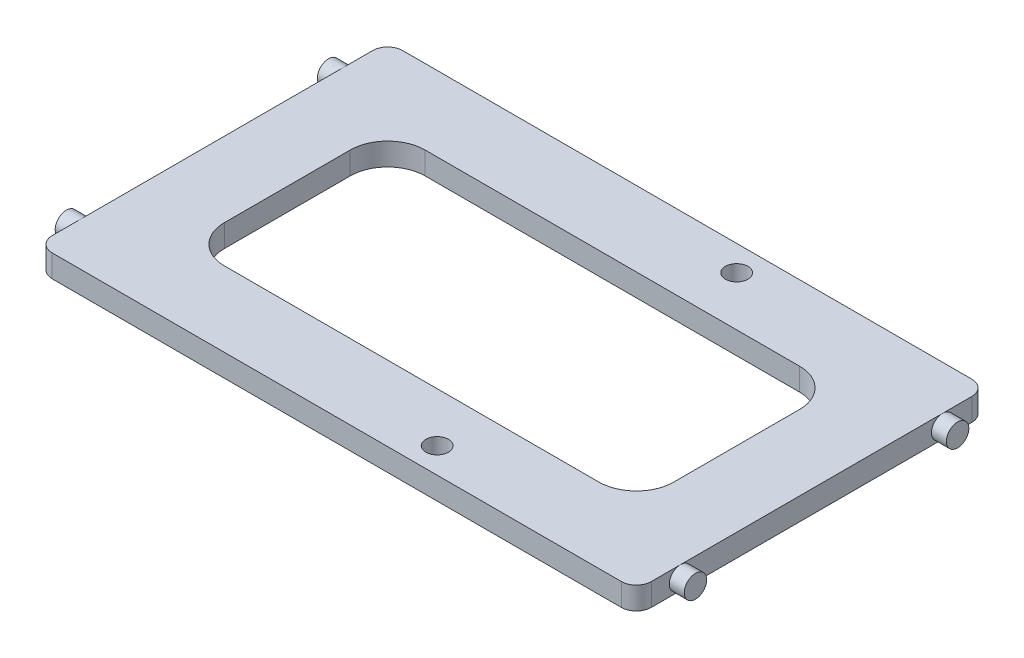
ISO-10303-21;
HEADER;
FILE_DESCRIPTION(('STEP AP214'),'2;1');
FILE_NAME('part.step','',(''),(''),'','','');
FILE_SCHEMA(('AUTOMOTIVE_DESIGN { 1 0 10303 214 1 1 1 1 }'));
ENDSEC;
DATA;
#1=APPLICATION_CONTEXT('core data for automotive mechanical design processes');
#2=APPLICATION_PROTOCOL_DEFINITION('international standard','automotive_design',2000,#1);
#3=PRODUCT_CONTEXT('',#1,'mechanical');
#4=PRODUCT('Part','Part','',(#3));
#5=PRODUCT_RELATED_PRODUCT_CATEGORY('part','',(#4));
#6=PRODUCT_DEFINITION_FORMATION('','',#4);
#7=PRODUCT_DEFINITION_CONTEXT('part definition',#1,'design');
#8=PRODUCT_DEFINITION('design','',#6,#7);
#9=PRODUCT_DEFINITION_SHAPE('','',#8);
#10=(LENGTH_UNIT() NAMED_UNIT(*) SI_UNIT(.MILLI.,.METRE.));
#11=(NAMED_UNIT(*) PLANE_ANGLE_UNIT() SI_UNIT($,.RADIAN.));
#12=(NAMED_UNIT(*) SI_UNIT($,.STERADIAN.) SOLID_ANGLE_UNIT());
#13=UNCERTAINTY_MEASURE_WITH_UNIT(LENGTH_MEASURE(1.E-05),#10,'distance_accuracy_value','');
#14=(GEOMETRIC_REPRESENTATION_CONTEXT(3) GLOBAL_UNCERTAINTY_ASSIGNED_CONTEXT((#13)) GLOBAL_UNIT_ASSIGNED_CONTEXT((#10,
#11,#12)) REPRESENTATION_CONTEXT('',''));
#15=CARTESIAN_POINT('',(0.,0.,0.));
#16=DIRECTION('',(0.,0.,1.));
#17=DIRECTION('',(1.,0.,0.));
#18=AXIS2_PLACEMENT_3D('',#15,#16,#17);
#19=CARTESIAN_POINT('',(101.6,3.81,0.));
#20=DIRECTION('',(-1.,0.,0.));
#21=DIRECTION('',(0.,0.,1.));
#22=AXIS2_PLACEMENT_3D('',#19,#20,#21);
#23=PLANE('',#22);
#24=DIRECTION('',(0.,0.,-1.));
#25=VECTOR('',#24,1.);
#26=CARTESIAN_POINT('',(101.6,3.81,0.));
#27=LINE('',#26,#25);
#28=CARTESIAN_POINT('',(101.6,3.81,-51.943));
#29=VERTEX_POINT('',#28);
#30=CARTESIAN_POINT('',(101.6,3.81,-56.896));
#31=VERTEX_POINT('',#30);
#32=EDGE_CURVE('E279',#29,#31,#27,.T.);
#33=ORIENTED_EDGE('',*,*,#32,.F.);
#34=CARTESIAN_POINT('',(101.6,1.905,-51.943));
#35=DIRECTION('',(-1.,0.,0.));
#36=DIRECTION('',(0.,0.,-1.));
#37=AXIS2_PLACEMENT_3D('',#34,#35,#36);
#38=CIRCLE('',#37,1.905);
#39=CARTESIAN_POINT('',(101.6,0.,-51.943));
#40=VERTEX_POINT('',#39);
#41=EDGE_CURVE('E231',#29,#40,#38,.T.);
#42=ORIENTED_EDGE('',*,*,#41,.T.);
#43=DIRECTION('',(0.,0.,-1.));
#44=VECTOR('',#43,1.);
#45=CARTESIAN_POINT('',(101.6,0.,0.));
#46=LINE('',#45,#44);
#47=CARTESIAN_POINT('',(101.6,0.,-56.896));
#48=VERTEX_POINT('',#47);
#49=EDGE_CURVE('E294',#40,#48,#46,.T.);
#50=ORIENTED_EDGE('',*,*,#49,.T.);
#51=DIRECTION('',(0.,-1.,0.));
#52=VECTOR('',#51,1.);
#53=CARTESIAN_POINT('',(101.6,3.81,-56.896));
#54=LINE('',#53,#52);
#55=EDGE_CURVE('E11',#48,#31,#54,.F.);
#56=ORIENTED_EDGE('',*,*,#55,.T.);
#57=EDGE_LOOP('',(#33,#42,#50,#56));
#58=FACE_BOUND('',#57,.T.);
#59=ADVANCED_FACE('F33',(#58),#23,.F.);
#60=CARTESIAN_POINT('',(101.6,0.,-7.493));
#61=VERTEX_POINT('',#60);
#62=EDGE_CURVE('E299',#61,#40,#46,.T.);
#63=ORIENTED_EDGE('',*,*,#62,.T.);
#64=EDGE_CURVE('E247',#40,#29,#38,.T.);
#65=ORIENTED_EDGE('',*,*,#64,.T.);
#66=CARTESIAN_POINT('',(101.6,3.81,-7.493));
#67=VERTEX_POINT('',#66);
#68=EDGE_CURVE('E284',#67,#29,#27,.T.);
#69=ORIENTED_EDGE('',*,*,#68,.F.);
#70=CARTESIAN_POINT('',(101.6,1.905,-7.493));
#71=DIRECTION('',(-1.,0.,0.));
#72=DIRECTION('',(0.,0.,1.));
#73=AXIS2_PLACEMENT_3D('',#70,#71,#72);
#74=CIRCLE('',#73,1.905);
#75=EDGE_CURVE('E254',#67,#61,#74,.T.);
#76=ORIENTED_EDGE('',*,*,#75,.T.);
#77=EDGE_LOOP('',(#63,#65,#69,#76));
#78=FACE_BOUND('',#77,.T.);
#79=ADVANCED_FACE('F411',(#78),#23,.F.);
#80=CARTESIAN_POINT('',(0.,3.81,0.));
#81=DIRECTION('',(1.,0.,0.));
#82=DIRECTION('',(0.,0.,-1.));
#83=AXIS2_PLACEMENT_3D('',#80,#81,#82);
#84=PLANE('',#83);
#85=CARTESIAN_POINT('',(0.,1.905,-51.943));
#86=DIRECTION('',(-1.,0.,0.));
#87=DIRECTION('',(0.,0.,-1.));
#88=AXIS2_PLACEMENT_3D('',#85,#86,#87);
#89=CIRCLE('',#88,1.905);
#90=CARTESIAN_POINT('',(0.,0.,-51.943));
#91=VERTEX_POINT('',#90);
#92=CARTESIAN_POINT('',(0.,3.81,-51.943));
#93=VERTEX_POINT('',#92);
#94=EDGE_CURVE('E261',#91,#93,#89,.T.);
#95=ORIENTED_EDGE('',*,*,#94,.F.);
#96=DIRECTION('',(0.,0.,1.));
#97=VECTOR('',#96,1.);
#98=CARTESIAN_POINT('',(0.,0.,0.));
#99=LINE('',#98,#97);
#100=CARTESIAN_POINT('',(0.,0.,-7.493));
#101=VERTEX_POINT('',#100);
#102=EDGE_CURVE('E291',#91,#101,#99,.T.);
#103=ORIENTED_EDGE('',*,*,#102,.T.);
#104=CARTESIAN_POINT('',(0.,1.905,-7.493));
#105=DIRECTION('',(-1.,0.,0.));
#106=DIRECTION('',(0.,0.,1.));
#107=AXIS2_PLACEMENT_3D('',#104,#105,#106);
#108=CIRCLE('',#107,1.905);
#109=CARTESIAN_POINT('',(0.,3.81,-7.493));
#110=VERTEX_POINT('',#109);
#111=EDGE_CURVE('E268',#110,#101,#108,.T.);
#112=ORIENTED_EDGE('',*,*,#111,.F.);
#113=DIRECTION('',(0.,0.,1.));
#114=VECTOR('',#113,1.);
#115=CARTESIAN_POINT('',(0.,3.81,0.));
#116=LINE('',#115,#114);
#117=EDGE_CURVE('E275',#93,#110,#116,.T.);
#118=ORIENTED_EDGE('',*,*,#117,.F.);
#119=EDGE_LOOP('',(#95,#103,#112,#118));
#120=FACE_BOUND('',#119,.T.);
#121=ADVANCED_FACE('F379',(#120),#84,.F.);
#122=EDGE_CURVE('E260',#101,#110,#108,.T.);
#123=ORIENTED_EDGE('',*,*,#122,.F.);
#124=CARTESIAN_POINT('',(0.,0.,-2.54));
#125=VERTEX_POINT('',#124);
#126=EDGE_CURVE('E267',#101,#125,#99,.T.);
#127=ORIENTED_EDGE('',*,*,#126,.T.);
#128=DIRECTION('',(0.,-1.,0.));
#129=VECTOR('',#128,1.);
#130=CARTESIAN_POINT('',(0.,3.81,-2.54));
#131=LINE('',#130,#129);
#132=CARTESIAN_POINT('',(0.,3.81,-2.54));
#133=VERTEX_POINT('',#132);
#134=EDGE_CURVE('E319',#125,#133,#131,.F.);
#135=ORIENTED_EDGE('',*,*,#134,.T.);
#136=EDGE_CURVE('E276',#110,#133,#116,.T.);
#137=ORIENTED_EDGE('',*,*,#136,.F.);
#138=EDGE_LOOP('',(#123,#127,#135,#137));
#139=FACE_BOUND('',#138,.T.);
#140=ADVANCED_FACE('F387',(#139),#84,.F.);
#141=EDGE_CURVE('E253',#93,#91,#89,.T.);
#142=ORIENTED_EDGE('',*,*,#141,.F.);
#143=CARTESIAN_POINT('',(0.,3.81,-56.896));
#144=VERTEX_POINT('',#143);
#145=EDGE_CURVE('E271',#144,#93,#116,.T.);
#146=ORIENTED_EDGE('',*,*,#145,.F.);
#147=DIRECTION('',(0.,-1.,0.));
#148=VECTOR('',#147,1.);
#149=CARTESIAN_POINT('',(0.,3.81,-56.896));
#150=LINE('',#149,#148);
#151=CARTESIAN_POINT('',(0.,0.,-56.896));
#152=VERTEX_POINT('',#151);
#153=EDGE_CURVE('E316',#144,#152,#150,.T.);
#154=ORIENTED_EDGE('',*,*,#153,.T.);
#155=EDGE_CURVE('E288',#152,#91,#99,.T.);
#156=ORIENTED_EDGE('',*,*,#155,.T.);
#157=EDGE_LOOP('',(#142,#146,#154,#156));
#158=FACE_BOUND('',#157,.T.);
#159=ADVANCED_FACE('F370',(#158),#84,.F.);
#160=CARTESIAN_POINT('',(0.,3.81,0.));
#161=DIRECTION('',(0.,0.,-1.));
#162=DIRECTION('',(-1.,0.,0.));
#163=AXIS2_PLACEMENT_3D('',#160,#161,#162);
#164=PLANE('',#163);
#165=DIRECTION('',(1.,0.,0.));
#166=VECTOR('',#165,1.);
#167=CARTESIAN_POINT('',(0.,3.81,0.));
#168=LINE('',#167,#166);
#169=CARTESIAN_POINT('',(2.54,3.81,0.));
#170=VERTEX_POINT('',#169);
#171=CARTESIAN_POINT('',(99.06,3.81,0.));
#172=VERTEX_POINT('',#171);
#173=EDGE_CURVE('E274',#170,#172,#168,.T.);
#174=ORIENTED_EDGE('',*,*,#173,.F.);
#175=DIRECTION('',(0.,-1.,0.));
#176=VECTOR('',#175,1.);
#177=CARTESIAN_POINT('',(2.54,3.81,0.));
#178=LINE('',#177,#176);
#179=CARTESIAN_POINT('',(2.54,0.,0.));
#180=VERTEX_POINT('',#179);
#181=EDGE_CURVE('E303',#170,#180,#178,.T.);
#182=ORIENTED_EDGE('',*,*,#181,.T.);
#183=DIRECTION('',(1.,0.,0.));
#184=VECTOR('',#183,1.);
#185=CARTESIAN_POINT('',(0.,0.,0.));
#186=LINE('',#185,#184);
#187=CARTESIAN_POINT('',(99.06,0.,0.));
#188=VERTEX_POINT('',#187);
#189=EDGE_CURVE('E290',#180,#188,#186,.T.);
#190=ORIENTED_EDGE('',*,*,#189,.T.);
#191=DIRECTION('',(0.,-1.,0.));
#192=VECTOR('',#191,1.);
#193=CARTESIAN_POINT('',(99.06,3.81,0.));
#194=LINE('',#193,#192);
#195=EDGE_CURVE('E287',#188,#172,#194,.F.);
#196=ORIENTED_EDGE('',*,*,#195,.T.);
#197=EDGE_LOOP('',(#174,#182,#190,#196));
#198=FACE_BOUND('',#197,.T.);
#199=ADVANCED_FACE('F393',(#198),#164,.F.);
#200=CARTESIAN_POINT('',(101.6,0.,-2.54));
#201=VERTEX_POINT('',#200);
#202=EDGE_CURVE('E295',#201,#61,#46,.T.);
#203=ORIENTED_EDGE('',*,*,#202,.T.);
#204=EDGE_CURVE('E246',#61,#67,#74,.T.);
#205=ORIENTED_EDGE('',*,*,#204,.T.);
#206=CARTESIAN_POINT('',(101.6,3.81,-2.54));
#207=VERTEX_POINT('',#206);
#208=EDGE_CURVE('E280',#207,#67,#27,.T.);
#209=ORIENTED_EDGE('',*,*,#208,.F.);
#210=DIRECTION('',(0.,-1.,0.));
#211=VECTOR('',#210,1.);
#212=CARTESIAN_POINT('',(101.6,3.81,-2.54));
#213=LINE('',#212,#211);
#214=EDGE_CURVE('E41',#207,#201,#213,.T.);
#215=ORIENTED_EDGE('',*,*,#214,.T.);
#216=EDGE_LOOP('',(#203,#205,#209,#215));
#217=FACE_BOUND('',#216,.T.);
#218=ADVANCED_FACE('F339',(#217),#23,.F.);
#219=CARTESIAN_POINT('',(0.,3.81,-59.436));
#220=DIRECTION('',(0.,0.,1.));
#221=DIRECTION('',(1.,0.,0.));
#222=AXIS2_PLACEMENT_3D('',#219,#220,#221);
#223=PLANE('',#222);
#224=DIRECTION('',(-1.,0.,0.));
#225=VECTOR('',#224,1.);
#226=CARTESIAN_POINT('',(0.,0.,-59.436));
#227=LINE('',#226,#225);
#228=CARTESIAN_POINT('',(99.06,0.,-59.436));
#229=VERTEX_POINT('',#228);
#230=CARTESIAN_POINT('',(2.54,0.,-59.436));
#231=VERTEX_POINT('',#230);
#232=EDGE_CURVE('E298',#229,#231,#227,.T.);
#233=ORIENTED_EDGE('',*,*,#232,.T.);
#234=DIRECTION('',(0.,-1.,0.));
#235=VECTOR('',#234,1.);
#236=CARTESIAN_POINT('',(2.54,3.81,-59.436));
#237=LINE('',#236,#235);
#238=CARTESIAN_POINT('',(2.54,3.81,-59.436));
#239=VERTEX_POINT('',#238);
#240=EDGE_CURVE('E333',#231,#239,#237,.F.);
#241=ORIENTED_EDGE('',*,*,#240,.T.);
#242=DIRECTION('',(-1.,0.,0.));
#243=VECTOR('',#242,1.);
#244=CARTESIAN_POINT('',(0.,3.81,-59.436));
#245=LINE('',#244,#243);
#246=CARTESIAN_POINT('',(99.06,3.81,-59.436));
#247=VERTEX_POINT('',#246);
#248=EDGE_CURVE('E283',#247,#239,#245,.T.);
#249=ORIENTED_EDGE('',*,*,#248,.F.);
#250=DIRECTION('',(0.,-1.,0.));
#251=VECTOR('',#250,1.);
#252=CARTESIAN_POINT('',(99.06,3.81,-59.436));
#253=LINE('',#252,#251);
#254=EDGE_CURVE('E330',#247,#229,#253,.T.);
#255=ORIENTED_EDGE('',*,*,#254,.T.);
#256=EDGE_LOOP('',(#233,#241,#249,#255));
#257=FACE_BOUND('',#256,.T.);
#258=ADVANCED_FACE('F363',(#257),#223,.F.);
#259=CARTESIAN_POINT('',(0.,3.81,0.));
#260=DIRECTION('',(0.,-1.,0.));
#261=DIRECTION('',(0.,0.,-1.));
#262=AXIS2_PLACEMENT_3D('',#259,#260,#261);
#263=PLANE('',#262);
#264=CARTESIAN_POINT('',(63.5,3.81,-4.318));
#265=DIRECTION('',(0.,1.,0.));
#266=DIRECTION('',(0.,0.,1.));
#267=AXIS2_PLACEMENT_3D('',#264,#265,#266);
#268=CIRCLE('',#267,1.90500000000001);
#269=CARTESIAN_POINT('',(63.5,3.81,-2.41299999999999));
#270=VERTEX_POINT('',#269);
#271=EDGE_CURVE('E662',#270,#270,#268,.T.);
#272=ORIENTED_EDGE('',*,*,#271,.F.);
#273=EDGE_LOOP('',(#272));
#274=FACE_BOUND('',#273,.T.);
#275=CARTESIAN_POINT('',(63.5,3.81,-55.118));
#276=DIRECTION('',(0.,1.,0.));
#277=DIRECTION('',(0.,0.,1.));
#278=AXIS2_PLACEMENT_3D('',#275,#276,#277);
#279=CIRCLE('',#278,1.90500000000001);
#280=CARTESIAN_POINT('',(63.5,3.81,-53.213));
#281=VERTEX_POINT('',#280);
#282=EDGE_CURVE('E195',#281,#281,#279,.T.);
#283=ORIENTED_EDGE('',*,*,#282,.F.);
#284=EDGE_LOOP('',(#283));
#285=FACE_BOUND('',#284,.T.);
#286=DIRECTION('',(0.,0.,1.));
#287=VECTOR('',#286,1.);
#288=CARTESIAN_POINT('',(88.9,3.81,-19.05));
#289=LINE('',#288,#287);
#290=CARTESIAN_POINT('',(88.9,3.81,-40.386));
#291=VERTEX_POINT('',#290);
#292=CARTESIAN_POINT('',(88.9,3.81,-19.05));
#293=VERTEX_POINT('',#292);
#294=EDGE_CURVE('E178',#291,#293,#289,.T.);
#295=ORIENTED_EDGE('',*,*,#294,.T.);
#296=CARTESIAN_POINT('',(82.55,3.81,-19.05));
#297=DIRECTION('',(0.,-1.,0.));
#298=DIRECTION('',(0.,0.,1.));
#299=AXIS2_PLACEMENT_3D('',#296,#297,#298);
#300=CIRCLE('',#299,6.35);
#301=CARTESIAN_POINT('',(82.5499999999999,3.81,-12.7));
#302=VERTEX_POINT('',#301);
#303=EDGE_CURVE('E172',#293,#302,#300,.T.);
#304=ORIENTED_EDGE('',*,*,#303,.T.);
#305=DIRECTION('',(-1.,0.,0.));
#306=VECTOR('',#305,1.);
#307=CARTESIAN_POINT('',(19.05,3.81,-12.7));
#308=LINE('',#307,#306);
#309=CARTESIAN_POINT('',(19.05,3.81,-12.7));
#310=VERTEX_POINT('',#309);
#311=EDGE_CURVE('E181',#302,#310,#308,.T.);
#312=ORIENTED_EDGE('',*,*,#311,.T.);
#313=CARTESIAN_POINT('',(19.05,3.81,-19.05));
#314=DIRECTION('',(0.,-1.,0.));
#315=DIRECTION('',(0.,0.,-1.));
#316=AXIS2_PLACEMENT_3D('',#313,#314,#315);
#317=CIRCLE('',#316,6.35);
#318=CARTESIAN_POINT('',(12.7,3.81,-19.05));
#319=VERTEX_POINT('',#318);
#320=EDGE_CURVE('E48',#310,#319,#317,.T.);
#321=ORIENTED_EDGE('',*,*,#320,.T.);
#322=DIRECTION('',(0.,0.,-1.));
#323=VECTOR('',#322,1.);
#324=CARTESIAN_POINT('',(12.7,3.81,-19.05));
#325=LINE('',#324,#323);
#326=CARTESIAN_POINT('',(12.7,3.81,-40.386));
#327=VERTEX_POINT('',#326);
#328=EDGE_CURVE('E199',#319,#327,#325,.T.);
#329=ORIENTED_EDGE('',*,*,#328,.T.);
#330=CARTESIAN_POINT('',(19.05,3.81,-40.386));
#331=DIRECTION('',(0.,-1.,0.));
#332=DIRECTION('',(0.,0.,-1.));
#333=AXIS2_PLACEMENT_3D('',#330,#331,#332);
#334=CIRCLE('',#333,6.35);
#335=CARTESIAN_POINT('',(19.05,3.81,-46.736));
#336=VERTEX_POINT('',#335);
#337=EDGE_CURVE('E202',#327,#336,#334,.T.);
#338=ORIENTED_EDGE('',*,*,#337,.T.);
#339=DIRECTION('',(1.,0.,0.));
#340=VECTOR('',#339,1.);
#341=CARTESIAN_POINT('',(19.05,3.81,-46.736));
#342=LINE('',#341,#340);
#343=CARTESIAN_POINT('',(82.5499999999999,3.81,-46.736));
#344=VERTEX_POINT('',#343);
#345=EDGE_CURVE('E205',#336,#344,#342,.T.);
#346=ORIENTED_EDGE('',*,*,#345,.T.);
#347=CARTESIAN_POINT('',(82.55,3.81,-40.386));
#348=DIRECTION('',(0.,-1.,0.));
#349=DIRECTION('',(0.,0.,-1.));
#350=AXIS2_PLACEMENT_3D('',#347,#348,#349);
#351=CIRCLE('',#350,6.34999999999999);
#352=EDGE_CURVE('E208',#344,#291,#351,.T.);
#353=ORIENTED_EDGE('',*,*,#352,.T.);
#354=EDGE_LOOP('',(#295,#304,#312,#321,#329,#338,#346,#353));
#355=FACE_BOUND('',#354,.T.);
#356=ORIENTED_EDGE('',*,*,#145,.T.);
#357=ORIENTED_EDGE('',*,*,#117,.T.);
#358=ORIENTED_EDGE('',*,*,#136,.T.);
#359=CARTESIAN_POINT('',(2.54,3.81,-2.54));
#360=DIRECTION('',(0.,-1.,0.));
#361=DIRECTION('',(0.,0.,-1.));
#362=AXIS2_PLACEMENT_3D('',#359,#360,#361);
#363=CIRCLE('',#362,2.54);
#364=EDGE_CURVE('E328',#133,#170,#363,.F.);
#365=ORIENTED_EDGE('',*,*,#364,.T.);
#366=ORIENTED_EDGE('',*,*,#173,.T.);
#367=CARTESIAN_POINT('',(99.06,3.81,-2.54));
#368=DIRECTION('',(0.,-1.,0.));
#369=DIRECTION('',(0.,0.,-1.));
#370=AXIS2_PLACEMENT_3D('',#367,#368,#369);
#371=CIRCLE('',#370,2.54);
#372=EDGE_CURVE('E322',#172,#207,#371,.F.);
#373=ORIENTED_EDGE('',*,*,#372,.T.);
#374=ORIENTED_EDGE('',*,*,#208,.T.);
#375=ORIENTED_EDGE('',*,*,#68,.T.);
#376=ORIENTED_EDGE('',*,*,#32,.T.);
#377=CARTESIAN_POINT('',(99.06,3.81,-56.896));
#378=DIRECTION('',(0.,-1.,0.));
#379=DIRECTION('',(0.,0.,-1.));
#380=AXIS2_PLACEMENT_3D('',#377,#378,#379);
#381=CIRCLE('',#380,2.54);
#382=EDGE_CURVE('E324',#31,#247,#381,.F.);
#383=ORIENTED_EDGE('',*,*,#382,.T.);
#384=ORIENTED_EDGE('',*,*,#248,.T.);
#385=CARTESIAN_POINT('',(2.54,3.81,-56.896));
#386=DIRECTION('',(0.,-1.,0.));
#387=DIRECTION('',(0.,0.,-1.));
#388=AXIS2_PLACEMENT_3D('',#385,#386,#387);
#389=CIRCLE('',#388,2.54);
#390=EDGE_CURVE('E326',#239,#144,#389,.F.);
#391=ORIENTED_EDGE('',*,*,#390,.T.);
#392=EDGE_LOOP('',(#356,#357,#358,#365,#366,#373,#374,#375,#376,#383,#384,#391));
#393=FACE_BOUND('',#392,.T.);
#394=ADVANCED_FACE('F185',(#274,#285,#355,#393),#263,.F.);
#395=CARTESIAN_POINT('',(0.,0.,0.));
#396=DIRECTION('',(0.,-1.,0.));
#397=DIRECTION('',(0.,0.,-1.));
#398=AXIS2_PLACEMENT_3D('',#395,#396,#397);
#399=PLANE('',#398);
#400=CARTESIAN_POINT('',(63.5,0.,-4.318));
#401=DIRECTION('',(0.,1.,0.));
#402=DIRECTION('',(0.,0.,1.));
#403=AXIS2_PLACEMENT_3D('',#400,#401,#402);
#404=CIRCLE('',#403,1.90500000000001);
#405=CARTESIAN_POINT('',(63.5,0.,-2.41299999999999));
#406=VERTEX_POINT('',#405);
#407=EDGE_CURVE('E213',#406,#406,#404,.T.);
#408=ORIENTED_EDGE('',*,*,#407,.T.);
#409=EDGE_LOOP('',(#408));
#410=FACE_BOUND('',#409,.T.);
#411=CARTESIAN_POINT('',(63.5,0.,-55.118));
#412=DIRECTION('',(0.,1.,0.));
#413=DIRECTION('',(0.,0.,1.));
#414=AXIS2_PLACEMENT_3D('',#411,#412,#413);
#415=CIRCLE('',#414,1.90500000000001);
#416=CARTESIAN_POINT('',(63.5,0.,-53.213));
#417=VERTEX_POINT('',#416);
#418=EDGE_CURVE('E663',#417,#417,#415,.T.);
#419=ORIENTED_EDGE('',*,*,#418,.T.);
#420=EDGE_LOOP('',(#419));
#421=FACE_BOUND('',#420,.T.);
#422=CARTESIAN_POINT('',(82.55,0.,-19.05));
#423=DIRECTION('',(0.,-1.,0.));
#424=DIRECTION('',(0.,0.,1.));
#425=AXIS2_PLACEMENT_3D('',#422,#423,#424);
#426=CIRCLE('',#425,6.35);
#427=CARTESIAN_POINT('',(88.9,0.,-19.05));
#428=VERTEX_POINT('',#427);
#429=CARTESIAN_POINT('',(82.5499999999999,0.,-12.7));
#430=VERTEX_POINT('',#429);
#431=EDGE_CURVE('E56',#428,#430,#426,.T.);
#432=ORIENTED_EDGE('',*,*,#431,.F.);
#433=DIRECTION('',(0.,0.,1.));
#434=VECTOR('',#433,1.);
#435=CARTESIAN_POINT('',(88.9,0.,-19.05));
#436=LINE('',#435,#434);
#437=CARTESIAN_POINT('',(88.9,0.,-40.386));
#438=VERTEX_POINT('',#437);
#439=EDGE_CURVE('E189',#438,#428,#436,.T.);
#440=ORIENTED_EDGE('',*,*,#439,.F.);
#441=CARTESIAN_POINT('',(82.55,0.,-40.386));
#442=DIRECTION('',(0.,-1.,0.));
#443=DIRECTION('',(0.,0.,-1.));
#444=AXIS2_PLACEMENT_3D('',#441,#442,#443);
#445=CIRCLE('',#444,6.34999999999999);
#446=CARTESIAN_POINT('',(82.5499999999999,0.,-46.736));
#447=VERTEX_POINT('',#446);
#448=EDGE_CURVE('E192',#447,#438,#445,.T.);
#449=ORIENTED_EDGE('',*,*,#448,.F.);
#450=DIRECTION('',(1.,0.,0.));
#451=VECTOR('',#450,1.);
#452=CARTESIAN_POINT('',(19.05,0.,-46.736));
#453=LINE('',#452,#451);
#454=CARTESIAN_POINT('',(19.05,0.,-46.736));
#455=VERTEX_POINT('',#454);
#456=EDGE_CURVE('E224',#455,#447,#453,.T.);
#457=ORIENTED_EDGE('',*,*,#456,.F.);
#458=CARTESIAN_POINT('',(19.05,0.,-40.386));
#459=DIRECTION('',(0.,-1.,0.));
#460=DIRECTION('',(0.,0.,-1.));
#461=AXIS2_PLACEMENT_3D('',#458,#459,#460);
#462=CIRCLE('',#461,6.35);
#463=CARTESIAN_POINT('',(12.7,0.,-40.386));
#464=VERTEX_POINT('',#463);
#465=EDGE_CURVE('E221',#464,#455,#462,.T.);
#466=ORIENTED_EDGE('',*,*,#465,.F.);
#467=DIRECTION('',(0.,0.,-1.));
#468=VECTOR('',#467,1.);
#469=CARTESIAN_POINT('',(12.7,0.,-19.05));
#470=LINE('',#469,#468);
#471=CARTESIAN_POINT('',(12.7,0.,-19.05));
#472=VERTEX_POINT('',#471);
#473=EDGE_CURVE('E218',#472,#464,#470,.T.);
#474=ORIENTED_EDGE('',*,*,#473,.F.);
#475=CARTESIAN_POINT('',(19.05,0.,-19.05));
#476=DIRECTION('',(0.,-1.,0.));
#477=DIRECTION('',(0.,0.,-1.));
#478=AXIS2_PLACEMENT_3D('',#475,#476,#477);
#479=CIRCLE('',#478,6.35);
#480=CARTESIAN_POINT('',(19.05,0.,-12.7));
#481=VERTEX_POINT('',#480);
#482=EDGE_CURVE('E215',#481,#472,#479,.T.);
#483=ORIENTED_EDGE('',*,*,#482,.F.);
#484=DIRECTION('',(-1.,0.,0.));
#485=VECTOR('',#484,1.);
#486=CARTESIAN_POINT('',(19.05,0.,-12.7));
#487=LINE('',#486,#485);
#488=EDGE_CURVE('E212',#430,#481,#487,.T.);
#489=ORIENTED_EDGE('',*,*,#488,.F.);
#490=EDGE_LOOP('',(#432,#440,#449,#457,#466,#474,#483,#489));
#491=FACE_BOUND('',#490,.T.);
#492=ORIENTED_EDGE('',*,*,#189,.F.);
#493=CARTESIAN_POINT('',(2.54,0.,-2.54));
#494=DIRECTION('',(0.,-1.,0.));
#495=DIRECTION('',(0.,0.,-1.));
#496=AXIS2_PLACEMENT_3D('',#493,#494,#495);
#497=CIRCLE('',#496,2.54);
#498=EDGE_CURVE('E313',#180,#125,#497,.T.);
#499=ORIENTED_EDGE('',*,*,#498,.T.);
#500=ORIENTED_EDGE('',*,*,#126,.F.);
#501=ORIENTED_EDGE('',*,*,#102,.F.);
#502=ORIENTED_EDGE('',*,*,#155,.F.);
#503=CARTESIAN_POINT('',(2.54,0.,-56.896));
#504=DIRECTION('',(0.,-1.,0.));
#505=DIRECTION('',(0.,0.,-1.));
#506=AXIS2_PLACEMENT_3D('',#503,#504,#505);
#507=CIRCLE('',#506,2.54);
#508=EDGE_CURVE('E311',#152,#231,#507,.T.);
#509=ORIENTED_EDGE('',*,*,#508,.T.);
#510=ORIENTED_EDGE('',*,*,#232,.F.);
#511=CARTESIAN_POINT('',(99.06,0.,-56.896));
#512=DIRECTION('',(0.,-1.,0.));
#513=DIRECTION('',(0.,0.,-1.));
#514=AXIS2_PLACEMENT_3D('',#511,#512,#513);
#515=CIRCLE('',#514,2.54);
#516=EDGE_CURVE('E308',#229,#48,#515,.T.);
#517=ORIENTED_EDGE('',*,*,#516,.T.);
#518=ORIENTED_EDGE('',*,*,#49,.F.);
#519=ORIENTED_EDGE('',*,*,#62,.F.);
#520=ORIENTED_EDGE('',*,*,#202,.F.);
#521=CARTESIAN_POINT('',(99.06,0.,-2.54));
#522=DIRECTION('',(0.,-1.,0.));
#523=DIRECTION('',(0.,0.,-1.));
#524=AXIS2_PLACEMENT_3D('',#521,#522,#523);
#525=CIRCLE('',#524,2.54);
#526=EDGE_CURVE('E306',#201,#188,#525,.T.);
#527=ORIENTED_EDGE('',*,*,#526,.T.);
#528=EDGE_LOOP('',(#492,#499,#500,#501,#502,#509,#510,#517,#518,#519,#520,#527));
#529=FACE_BOUND('',#528,.T.);
#530=ADVANCED_FACE('F346',(#410,#421,#491,#529),#399,.T.);
#531=CARTESIAN_POINT('',(2.54,3.81,-2.54));
#532=DIRECTION('',(0.,-1.,0.));
#533=DIRECTION('',(0.,0.,-1.));
#534=AXIS2_PLACEMENT_3D('',#531,#532,#533);
#535=CYLINDRICAL_SURFACE('',#534,2.54);
#536=ORIENTED_EDGE('',*,*,#364,.F.);
#537=ORIENTED_EDGE('',*,*,#134,.F.);
#538=ORIENTED_EDGE('',*,*,#498,.F.);
#539=ORIENTED_EDGE('',*,*,#181,.F.);
#540=EDGE_LOOP('',(#536,#537,#538,#539));
#541=FACE_BOUND('',#540,.T.);
#542=ADVANCED_FACE('F391',(#541),#535,.T.);
#543=CARTESIAN_POINT('',(2.54,3.81,-56.896));
#544=DIRECTION('',(0.,-1.,0.));
#545=DIRECTION('',(0.,0.,-1.));
#546=AXIS2_PLACEMENT_3D('',#543,#544,#545);
#547=CYLINDRICAL_SURFACE('',#546,2.54);
#548=ORIENTED_EDGE('',*,*,#390,.F.);
#549=ORIENTED_EDGE('',*,*,#240,.F.);
#550=ORIENTED_EDGE('',*,*,#508,.F.);
#551=ORIENTED_EDGE('',*,*,#153,.F.);
#552=EDGE_LOOP('',(#548,#549,#550,#551));
#553=FACE_BOUND('',#552,.T.);
#554=ADVANCED_FACE('F366',(#553),#547,.T.);
#555=CARTESIAN_POINT('',(99.06,3.81,-56.896));
#556=DIRECTION('',(0.,-1.,0.));
#557=DIRECTION('',(0.,0.,-1.));
#558=AXIS2_PLACEMENT_3D('',#555,#556,#557);
#559=CYLINDRICAL_SURFACE('',#558,2.54);
#560=ORIENTED_EDGE('',*,*,#382,.F.);
#561=ORIENTED_EDGE('',*,*,#55,.F.);
#562=ORIENTED_EDGE('',*,*,#516,.F.);
#563=ORIENTED_EDGE('',*,*,#254,.F.);
#564=EDGE_LOOP('',(#560,#561,#562,#563));
#565=FACE_BOUND('',#564,.T.);
#566=ADVANCED_FACE('F358',(#565),#559,.T.);
#567=CARTESIAN_POINT('',(99.06,3.81,-2.54));
#568=DIRECTION('',(0.,-1.,0.));
#569=DIRECTION('',(0.,0.,-1.));
#570=AXIS2_PLACEMENT_3D('',#567,#568,#569);
#571=CYLINDRICAL_SURFACE('',#570,2.54);
#572=ORIENTED_EDGE('',*,*,#372,.F.);
#573=ORIENTED_EDGE('',*,*,#195,.F.);
#574=ORIENTED_EDGE('',*,*,#526,.F.);
#575=ORIENTED_EDGE('',*,*,#214,.F.);
#576=EDGE_LOOP('',(#572,#573,#574,#575));
#577=FACE_BOUND('',#576,.T.);
#578=ADVANCED_FACE('F35',(#577),#571,.T.);
#579=CARTESIAN_POINT('',(-2.54,1.905,-7.493));
#580=DIRECTION('',(1.,0.,0.));
#581=DIRECTION('',(0.,0.,-1.));
#582=AXIS2_PLACEMENT_3D('',#579,#580,#581);
#583=CYLINDRICAL_SURFACE('',#582,1.905);
#584=CARTESIAN_POINT('',(-2.54,1.905,-7.493));
#585=DIRECTION('',(-1.,0.,0.));
#586=DIRECTION('',(0.,0.,1.));
#587=AXIS2_PLACEMENT_3D('',#584,#585,#586);
#588=CIRCLE('',#587,1.905);
#589=CARTESIAN_POINT('',(-2.54,1.905,-5.588));
#590=VERTEX_POINT('',#589);
#591=EDGE_CURVE('E264',#590,#590,#588,.T.);
#592=ORIENTED_EDGE('',*,*,#591,.F.);
#593=EDGE_LOOP('',(#592));
#594=FACE_BOUND('',#593,.T.);
#595=ORIENTED_EDGE('',*,*,#111,.T.);
#596=ORIENTED_EDGE('',*,*,#122,.T.);
#597=EDGE_LOOP('',(#595,#596));
#598=FACE_BOUND('',#597,.T.);
#599=ADVANCED_FACE('F396',(#594,#598),#583,.T.);
#600=CARTESIAN_POINT('',(-2.54,1.905,-7.493));
#601=DIRECTION('',(-1.,0.,0.));
#602=DIRECTION('',(0.,0.,1.));
#603=AXIS2_PLACEMENT_3D('',#600,#601,#602);
#604=PLANE('',#603);
#605=ORIENTED_EDGE('',*,*,#591,.T.);
#606=EDGE_LOOP('',(#605));
#607=FACE_BOUND('',#606,.T.);
#608=ADVANCED_FACE('F398',(#607),#604,.T.);
#609=CARTESIAN_POINT('',(-2.54,1.905,-51.943));
#610=DIRECTION('',(1.,0.,0.));
#611=DIRECTION('',(0.,0.,-1.));
#612=AXIS2_PLACEMENT_3D('',#609,#610,#611);
#613=CYLINDRICAL_SURFACE('',#612,1.905);
#614=CARTESIAN_POINT('',(-2.54,1.905,-51.943));
#615=DIRECTION('',(-1.,0.,0.));
#616=DIRECTION('',(0.,0.,-1.));
#617=AXIS2_PLACEMENT_3D('',#614,#615,#616);
#618=CIRCLE('',#617,1.905);
#619=CARTESIAN_POINT('',(-2.54,1.905,-53.848));
#620=VERTEX_POINT('',#619);
#621=EDGE_CURVE('E257',#620,#620,#618,.T.);
#622=ORIENTED_EDGE('',*,*,#621,.F.);
#623=EDGE_LOOP('',(#622));
#624=FACE_BOUND('',#623,.T.);
#625=ORIENTED_EDGE('',*,*,#94,.T.);
#626=ORIENTED_EDGE('',*,*,#141,.T.);
#627=EDGE_LOOP('',(#625,#626));
#628=FACE_BOUND('',#627,.T.);
#629=ADVANCED_FACE('F405',(#624,#628),#613,.T.);
#630=CARTESIAN_POINT('',(-2.54,1.905,-51.943));
#631=DIRECTION('',(1.,0.,0.));
#632=DIRECTION('',(0.,0.,-1.));
#633=AXIS2_PLACEMENT_3D('',#630,#631,#632);
#634=PLANE('',#633);
#635=ORIENTED_EDGE('',*,*,#621,.T.);
#636=EDGE_LOOP('',(#635));
#637=FACE_BOUND('',#636,.T.);
#638=ADVANCED_FACE('F480',(#637),#634,.F.);
#639=CARTESIAN_POINT('',(104.14,1.905,-7.493));
#640=DIRECTION('',(-1.,0.,0.));
#641=DIRECTION('',(0.,0.,1.));
#642=AXIS2_PLACEMENT_3D('',#639,#640,#641);
#643=CYLINDRICAL_SURFACE('',#642,1.905);
#644=CARTESIAN_POINT('',(104.14,1.905,-7.493));
#645=DIRECTION('',(-1.,0.,0.));
#646=DIRECTION('',(0.,0.,1.));
#647=AXIS2_PLACEMENT_3D('',#644,#645,#646);
#648=CIRCLE('',#647,1.905);
#649=CARTESIAN_POINT('',(104.14,1.905,-5.588));
#650=VERTEX_POINT('',#649);
#651=EDGE_CURVE('E250',#650,#650,#648,.T.);
#652=ORIENTED_EDGE('',*,*,#651,.T.);
#653=EDGE_LOOP('',(#652));
#654=FACE_BOUND('',#653,.T.);
#655=ORIENTED_EDGE('',*,*,#75,.F.);
#656=ORIENTED_EDGE('',*,*,#204,.F.);
#657=EDGE_LOOP('',(#655,#656));
#658=FACE_BOUND('',#657,.T.);
#659=ADVANCED_FACE('F489',(#654,#658),#643,.T.);
#660=CARTESIAN_POINT('',(104.14,1.905,-7.493));
#661=DIRECTION('',(1.,0.,0.));
#662=DIRECTION('',(0.,0.,1.));
#663=AXIS2_PLACEMENT_3D('',#660,#661,#662);
#664=PLANE('',#663);
#665=ORIENTED_EDGE('',*,*,#651,.F.);
#666=EDGE_LOOP('',(#665));
#667=FACE_BOUND('',#666,.T.);
#668=ADVANCED_FACE('F515',(#667),#664,.T.);
#669=CARTESIAN_POINT('',(104.14,1.905,-51.943));
#670=DIRECTION('',(-1.,0.,0.));
#671=DIRECTION('',(0.,0.,1.));
#672=AXIS2_PLACEMENT_3D('',#669,#670,#671);
#673=CYLINDRICAL_SURFACE('',#672,1.905);
#674=CARTESIAN_POINT('',(104.14,1.905,-51.943));
#675=DIRECTION('',(-1.,0.,0.));
#676=DIRECTION('',(0.,0.,-1.));
#677=AXIS2_PLACEMENT_3D('',#674,#675,#676);
#678=CIRCLE('',#677,1.905);
#679=CARTESIAN_POINT('',(104.14,1.905,-53.848));
#680=VERTEX_POINT('',#679);
#681=EDGE_CURVE('E243',#680,#680,#678,.T.);
#682=ORIENTED_EDGE('',*,*,#681,.T.);
#683=EDGE_LOOP('',(#682));
#684=FACE_BOUND('',#683,.T.);
#685=ORIENTED_EDGE('',*,*,#64,.F.);
#686=ORIENTED_EDGE('',*,*,#41,.F.);
#687=EDGE_LOOP('',(#685,#686));
#688=FACE_BOUND('',#687,.T.);
#689=ADVANCED_FACE('F525',(#684,#688),#673,.T.);
#690=CARTESIAN_POINT('',(104.14,1.905,-51.943));
#691=DIRECTION('',(-1.,0.,0.));
#692=DIRECTION('',(0.,0.,-1.));
#693=AXIS2_PLACEMENT_3D('',#690,#691,#692);
#694=PLANE('',#693);
#695=ORIENTED_EDGE('',*,*,#681,.F.);
#696=EDGE_LOOP('',(#695));
#697=FACE_BOUND('',#696,.T.);
#698=ADVANCED_FACE('F535',(#697),#694,.F.);
#699=CARTESIAN_POINT('',(82.55,3.81,-19.05));
#700=DIRECTION('',(0.,-1.,0.));
#701=DIRECTION('',(0.,0.,-1.));
#702=AXIS2_PLACEMENT_3D('',#699,#700,#701);
#703=CYLINDRICAL_SURFACE('',#702,6.35);
#704=ORIENTED_EDGE('',*,*,#431,.T.);
#705=DIRECTION('',(0.,-1.,0.));
#706=VECTOR('',#705,1.);
#707=CARTESIAN_POINT('',(82.5499999999999,3.81,-12.7));
#708=LINE('',#707,#706);
#709=EDGE_CURVE('E168',#302,#430,#708,.T.);
#710=ORIENTED_EDGE('',*,*,#709,.F.);
#711=ORIENTED_EDGE('',*,*,#303,.F.);
#712=DIRECTION('',(0.,-1.,0.));
#713=VECTOR('',#712,1.);
#714=CARTESIAN_POINT('',(88.9,3.81,-19.05));
#715=LINE('',#714,#713);
#716=EDGE_CURVE('E229',#293,#428,#715,.T.);
#717=ORIENTED_EDGE('',*,*,#716,.T.);
#718=EDGE_LOOP('',(#704,#710,#711,#717));
#719=FACE_BOUND('',#718,.T.);
#720=ADVANCED_FACE('F170',(#719),#703,.F.);
#721=CARTESIAN_POINT('',(88.9,3.81,-19.05));
#722=DIRECTION('',(1.,0.,0.));
#723=DIRECTION('',(0.,0.,-1.));
#724=AXIS2_PLACEMENT_3D('',#721,#722,#723);
#725=PLANE('',#724);
#726=ORIENTED_EDGE('',*,*,#439,.T.);
#727=ORIENTED_EDGE('',*,*,#716,.F.);
#728=ORIENTED_EDGE('',*,*,#294,.F.);
#729=DIRECTION('',(0.,-1.,0.));
#730=VECTOR('',#729,1.);
#731=CARTESIAN_POINT('',(88.9,3.81,-40.386));
#732=LINE('',#731,#730);
#733=EDGE_CURVE('E232',#291,#438,#732,.T.);
#734=ORIENTED_EDGE('',*,*,#733,.T.);
#735=EDGE_LOOP('',(#726,#727,#728,#734));
#736=FACE_BOUND('',#735,.T.);
#737=ADVANCED_FACE('F554',(#736),#725,.F.);
#738=CARTESIAN_POINT('',(82.55,3.81,-40.386));
#739=DIRECTION('',(0.,-1.,0.));
#740=DIRECTION('',(0.,0.,-1.));
#741=AXIS2_PLACEMENT_3D('',#738,#739,#740);
#742=CYLINDRICAL_SURFACE('',#741,6.34999999999999);
#743=ORIENTED_EDGE('',*,*,#448,.T.);
#744=ORIENTED_EDGE('',*,*,#733,.F.);
#745=ORIENTED_EDGE('',*,*,#352,.F.);
#746=DIRECTION('',(0.,-1.,0.));
#747=VECTOR('',#746,1.);
#748=CARTESIAN_POINT('',(82.5499999999999,3.81,-46.736));
#749=LINE('',#748,#747);
#750=EDGE_CURVE('E234',#344,#447,#749,.T.);
#751=ORIENTED_EDGE('',*,*,#750,.T.);
#752=EDGE_LOOP('',(#743,#744,#745,#751));
#753=FACE_BOUND('',#752,.T.);
#754=ADVANCED_FACE('F563',(#753),#742,.F.);
#755=CARTESIAN_POINT('',(19.05,3.81,-46.736));
#756=DIRECTION('',(0.,0.,-1.));
#757=DIRECTION('',(-1.,0.,0.));
#758=AXIS2_PLACEMENT_3D('',#755,#756,#757);
#759=PLANE('',#758);
#760=ORIENTED_EDGE('',*,*,#456,.T.);
#761=ORIENTED_EDGE('',*,*,#750,.F.);
#762=ORIENTED_EDGE('',*,*,#345,.F.);
#763=DIRECTION('',(0.,-1.,0.));
#764=VECTOR('',#763,1.);
#765=CARTESIAN_POINT('',(19.05,3.81,-46.736));
#766=LINE('',#765,#764);
#767=EDGE_CURVE('E236',#336,#455,#766,.T.);
#768=ORIENTED_EDGE('',*,*,#767,.T.);
#769=EDGE_LOOP('',(#760,#761,#762,#768));
#770=FACE_BOUND('',#769,.T.);
#771=ADVANCED_FACE('F573',(#770),#759,.F.);
#772=CARTESIAN_POINT('',(19.05,3.81,-40.386));
#773=DIRECTION('',(0.,-1.,0.));
#774=DIRECTION('',(0.,0.,-1.));
#775=AXIS2_PLACEMENT_3D('',#772,#773,#774);
#776=CYLINDRICAL_SURFACE('',#775,6.35);
#777=ORIENTED_EDGE('',*,*,#465,.T.);
#778=ORIENTED_EDGE('',*,*,#767,.F.);
#779=ORIENTED_EDGE('',*,*,#337,.F.);
#780=DIRECTION('',(0.,-1.,0.));
#781=VECTOR('',#780,1.);
#782=CARTESIAN_POINT('',(12.7,3.81,-40.386));
#783=LINE('',#782,#781);
#784=EDGE_CURVE('E238',#327,#464,#783,.T.);
#785=ORIENTED_EDGE('',*,*,#784,.T.);
#786=EDGE_LOOP('',(#777,#778,#779,#785));
#787=FACE_BOUND('',#786,.T.);
#788=ADVANCED_FACE('F583',(#787),#776,.F.);
#789=CARTESIAN_POINT('',(12.7,3.81,-19.05));
#790=DIRECTION('',(-1.,0.,0.));
#791=DIRECTION('',(0.,0.,1.));
#792=AXIS2_PLACEMENT_3D('',#789,#790,#791);
#793=PLANE('',#792);
#794=ORIENTED_EDGE('',*,*,#473,.T.);
#795=ORIENTED_EDGE('',*,*,#784,.F.);
#796=ORIENTED_EDGE('',*,*,#328,.F.);
#797=DIRECTION('',(0.,-1.,0.));
#798=VECTOR('',#797,1.);
#799=CARTESIAN_POINT('',(12.7,3.81,-19.05));
#800=LINE('',#799,#798);
#801=EDGE_CURVE('E240',#319,#472,#800,.T.);
#802=ORIENTED_EDGE('',*,*,#801,.T.);
#803=EDGE_LOOP('',(#794,#795,#796,#802));
#804=FACE_BOUND('',#803,.T.);
#805=ADVANCED_FACE('F593',(#804),#793,.F.);
#806=CARTESIAN_POINT('',(19.05,3.81,-19.05));
#807=DIRECTION('',(0.,-1.,0.));
#808=DIRECTION('',(0.,0.,-1.));
#809=AXIS2_PLACEMENT_3D('',#806,#807,#808);
#810=CYLINDRICAL_SURFACE('',#809,6.35);
#811=ORIENTED_EDGE('',*,*,#482,.T.);
#812=ORIENTED_EDGE('',*,*,#801,.F.);
#813=ORIENTED_EDGE('',*,*,#320,.F.);
#814=DIRECTION('',(0.,-1.,0.));
#815=VECTOR('',#814,1.);
#816=CARTESIAN_POINT('',(19.05,3.81,-12.7));
#817=LINE('',#816,#815);
#818=EDGE_CURVE('E177',#310,#481,#817,.T.);
#819=ORIENTED_EDGE('',*,*,#818,.T.);
#820=EDGE_LOOP('',(#811,#812,#813,#819));
#821=FACE_BOUND('',#820,.T.);
#822=ADVANCED_FACE('F603',(#821),#810,.F.);
#823=CARTESIAN_POINT('',(19.05,3.81,-12.7));
#824=DIRECTION('',(0.,0.,1.));
#825=DIRECTION('',(1.,0.,0.));
#826=AXIS2_PLACEMENT_3D('',#823,#824,#825);
#827=PLANE('',#826);
#828=ORIENTED_EDGE('',*,*,#488,.T.);
#829=ORIENTED_EDGE('',*,*,#818,.F.);
#830=ORIENTED_EDGE('',*,*,#311,.F.);
#831=ORIENTED_EDGE('',*,*,#709,.T.);
#832=EDGE_LOOP('',(#828,#829,#830,#831));
#833=FACE_BOUND('',#832,.T.);
#834=ADVANCED_FACE('F182',(#833),#827,.F.);
#835=CARTESIAN_POINT('',(63.5,0.,-55.118));
#836=DIRECTION('',(0.,1.,0.));
#837=DIRECTION('',(0.,0.,1.));
#838=AXIS2_PLACEMENT_3D('',#835,#836,#837);
#839=CYLINDRICAL_SURFACE('',#838,1.90500000000001);
#840=ORIENTED_EDGE('',*,*,#418,.F.);
#841=EDGE_LOOP('',(#840));
#842=FACE_BOUND('',#841,.T.);
#843=ORIENTED_EDGE('',*,*,#282,.T.);
#844=EDGE_LOOP('',(#843));
#845=FACE_BOUND('',#844,.T.);
#846=ADVANCED_FACE('F621',(#842,#845),#839,.F.);
#847=CARTESIAN_POINT('',(63.5,0.,-4.318));
#848=DIRECTION('',(0.,1.,0.));
#849=DIRECTION('',(0.,0.,1.));
#850=AXIS2_PLACEMENT_3D('',#847,#848,#849);
#851=CYLINDRICAL_SURFACE('',#850,1.90500000000001);
#852=ORIENTED_EDGE('',*,*,#407,.F.);
#853=EDGE_LOOP('',(#852));
#854=FACE_BOUND('',#853,.T.);
#855=ORIENTED_EDGE('',*,*,#271,.T.);
#856=EDGE_LOOP('',(#855));
#857=FACE_BOUND('',#856,.T.);
#858=ADVANCED_FACE('F643',(#854,#857),#851,.F.);
#859=CLOSED_SHELL('',(#59,#79,#121,#140,#159,#199,#218,#258,#394,#530,#542,#554,#566,#578,#599,
#608,#629,#638,#659,#668,#689,#698,#720,#737,#754,#771,#788,#805,#822,#834,#846,#858));
#860=MANIFOLD_SOLID_BREP('B2',#859);
#861=ADVANCED_BREP_SHAPE_REPRESENTATION('',(#18,#860),#14);
#862=SHAPE_DEFINITION_REPRESENTATION(#9,#861);
ENDSEC;
END-ISO-10303-21;
